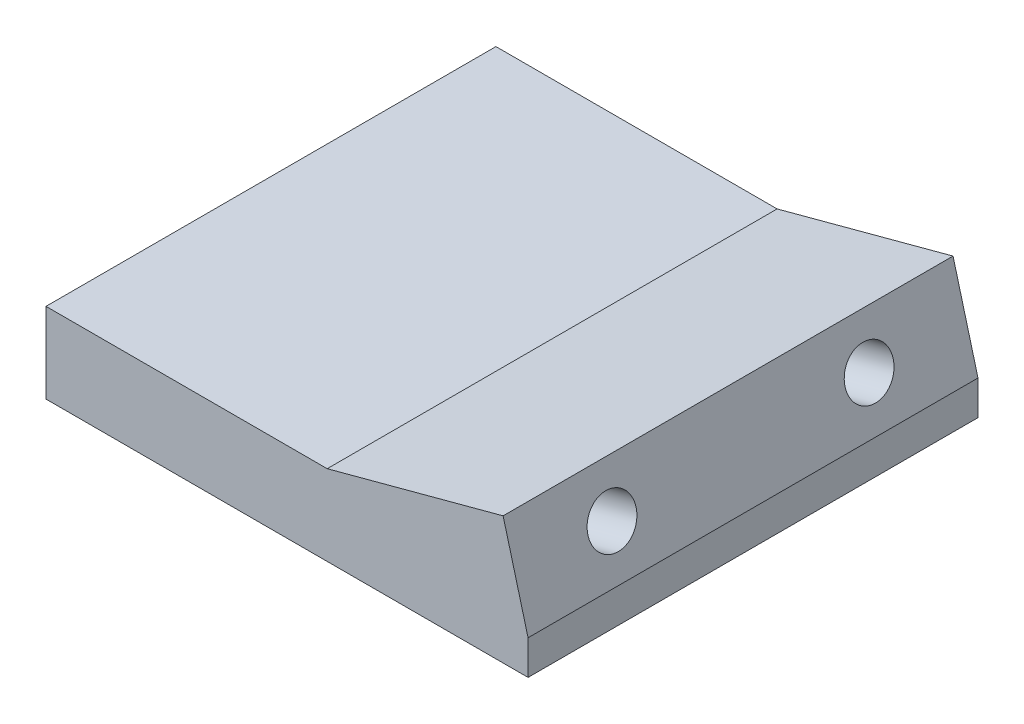
ISO-10303-21;
HEADER;
FILE_DESCRIPTION(('STEP AP214'),'2;1');
FILE_NAME('part.step','',(''),(''),'','','');
FILE_SCHEMA(('AUTOMOTIVE_DESIGN { 1 0 10303 214 1 1 1 1 }'));
ENDSEC;
DATA;
#1=APPLICATION_CONTEXT('core data for automotive mechanical design processes');
#2=APPLICATION_PROTOCOL_DEFINITION('international standard','automotive_design',2000,#1);
#3=PRODUCT_CONTEXT('',#1,'mechanical');
#4=PRODUCT('Part','Part','',(#3));
#5=PRODUCT_RELATED_PRODUCT_CATEGORY('part','',(#4));
#6=PRODUCT_DEFINITION_FORMATION('','',#4);
#7=PRODUCT_DEFINITION_CONTEXT('part definition',#1,'design');
#8=PRODUCT_DEFINITION('design','',#6,#7);
#9=PRODUCT_DEFINITION_SHAPE('','',#8);
#10=(LENGTH_UNIT() NAMED_UNIT(*) SI_UNIT(.MILLI.,.METRE.));
#11=(NAMED_UNIT(*) PLANE_ANGLE_UNIT() SI_UNIT($,.RADIAN.));
#12=(NAMED_UNIT(*) SI_UNIT($,.STERADIAN.) SOLID_ANGLE_UNIT());
#13=UNCERTAINTY_MEASURE_WITH_UNIT(LENGTH_MEASURE(1.E-05),#10,'distance_accuracy_value','');
#14=(GEOMETRIC_REPRESENTATION_CONTEXT(3) GLOBAL_UNCERTAINTY_ASSIGNED_CONTEXT((#13)) GLOBAL_UNIT_ASSIGNED_CONTEXT((#10,
#11,#12)) REPRESENTATION_CONTEXT('',''));
#15=CARTESIAN_POINT('',(0.,0.,0.));
#16=DIRECTION('',(0.,0.,1.));
#17=DIRECTION('',(1.,0.,0.));
#18=AXIS2_PLACEMENT_3D('',#15,#16,#17);
#19=CARTESIAN_POINT('',(0.,0.,44.45));
#20=DIRECTION('',(1.,0.,0.));
#21=DIRECTION('',(0.,0.,-1.));
#22=AXIS2_PLACEMENT_3D('',#19,#20,#21);
#23=PLANE('',#22);
#24=DIRECTION('',(0.,-1.,0.));
#25=VECTOR('',#24,1.);
#26=CARTESIAN_POINT('',(0.,0.,-44.45));
#27=LINE('',#26,#25);
#28=CARTESIAN_POINT('',(0.,15.875,-44.45));
#29=VERTEX_POINT('',#28);
#30=CARTESIAN_POINT('',(0.,0.,-44.45));
#31=VERTEX_POINT('',#30);
#32=EDGE_CURVE('E128',#29,#31,#27,.T.);
#33=ORIENTED_EDGE('',*,*,#32,.T.);
#34=DIRECTION('',(0.,0.,-1.));
#35=VECTOR('',#34,1.);
#36=CARTESIAN_POINT('',(0.,0.,44.45));
#37=LINE('',#36,#35);
#38=CARTESIAN_POINT('',(0.,0.,44.45));
#39=VERTEX_POINT('',#38);
#40=EDGE_CURVE('E11',#39,#31,#37,.T.);
#41=ORIENTED_EDGE('',*,*,#40,.F.);
#42=DIRECTION('',(0.,-1.,0.));
#43=VECTOR('',#42,1.);
#44=CARTESIAN_POINT('',(0.,0.,44.45));
#45=LINE('',#44,#43);
#46=CARTESIAN_POINT('',(0.,15.875,44.45));
#47=VERTEX_POINT('',#46);
#48=EDGE_CURVE('E145',#47,#39,#45,.T.);
#49=ORIENTED_EDGE('',*,*,#48,.F.);
#50=DIRECTION('',(0.,0.,-1.));
#51=VECTOR('',#50,1.);
#52=CARTESIAN_POINT('',(0.,15.875,44.45));
#53=LINE('',#52,#51);
#54=EDGE_CURVE('E124',#47,#29,#53,.T.);
#55=ORIENTED_EDGE('',*,*,#54,.T.);
#56=EDGE_LOOP('',(#33,#41,#49,#55));
#57=FACE_BOUND('',#56,.T.);
#58=ADVANCED_FACE('F39',(#57),#23,.F.);
#59=CARTESIAN_POINT('',(0.,0.,44.45));
#60=DIRECTION('',(0.,1.,0.));
#61=DIRECTION('',(0.,0.,1.));
#62=AXIS2_PLACEMENT_3D('',#59,#60,#61);
#63=PLANE('',#62);
#64=CARTESIAN_POINT('',(33.1179674114575,0.,25.4));
#65=DIRECTION('',(0.,1.,0.));
#66=DIRECTION('',(1.,0.,0.));
#67=AXIS2_PLACEMENT_3D('',#64,#65,#66);
#68=ELLIPSE('',#67,18.4008869908067,4.76249999999999);
#69=CARTESIAN_POINT('',(51.5188544022642,0.,25.4));
#70=VERTEX_POINT('',#69);
#71=EDGE_CURVE('E198',#70,#70,#68,.T.);
#72=ORIENTED_EDGE('',*,*,#71,.T.);
#73=EDGE_LOOP('',(#72));
#74=FACE_BOUND('',#73,.T.);
#75=CARTESIAN_POINT('',(33.1179674114575,0.,-25.4));
#76=DIRECTION('',(0.,1.,0.));
#77=DIRECTION('',(1.,0.,0.));
#78=AXIS2_PLACEMENT_3D('',#75,#76,#77);
#79=ELLIPSE('',#78,18.4008869908067,4.76249999999999);
#80=CARTESIAN_POINT('',(51.5188544022642,0.,-25.4));
#81=VERTEX_POINT('',#80);
#82=EDGE_CURVE('E133',#81,#81,#79,.T.);
#83=ORIENTED_EDGE('',*,*,#82,.T.);
#84=EDGE_LOOP('',(#83));
#85=FACE_BOUND('',#84,.T.);
#86=DIRECTION('',(1.,0.,0.));
#87=VECTOR('',#86,1.);
#88=CARTESIAN_POINT('',(0.,0.,-44.45));
#89=LINE('',#88,#87);
#90=CARTESIAN_POINT('',(95.25,0.,-44.45));
#91=VERTEX_POINT('',#90);
#92=EDGE_CURVE('E132',#31,#91,#89,.T.);
#93=ORIENTED_EDGE('',*,*,#92,.T.);
#94=DIRECTION('',(0.,0.,-1.));
#95=VECTOR('',#94,1.);
#96=CARTESIAN_POINT('',(95.25,0.,44.45));
#97=LINE('',#96,#95);
#98=CARTESIAN_POINT('',(95.25,0.,44.45));
#99=VERTEX_POINT('',#98);
#100=EDGE_CURVE('E48',#99,#91,#97,.T.);
#101=ORIENTED_EDGE('',*,*,#100,.F.);
#102=DIRECTION('',(1.,0.,0.));
#103=VECTOR('',#102,1.);
#104=CARTESIAN_POINT('',(0.,0.,44.45));
#105=LINE('',#104,#103);
#106=EDGE_CURVE('E93',#39,#99,#105,.T.);
#107=ORIENTED_EDGE('',*,*,#106,.F.);
#108=ORIENTED_EDGE('',*,*,#40,.T.);
#109=EDGE_LOOP('',(#93,#101,#107,#108));
#110=FACE_BOUND('',#109,.T.);
#111=ADVANCED_FACE('F173',(#74,#85,#110),#63,.F.);
#112=CARTESIAN_POINT('',(95.25,0.,44.45));
#113=DIRECTION('',(-1.,0.,0.));
#114=DIRECTION('',(0.,-1.,0.));
#115=AXIS2_PLACEMENT_3D('',#112,#113,#114);
#116=PLANE('',#115);
#117=DIRECTION('',(0.,1.,0.));
#118=VECTOR('',#117,1.);
#119=CARTESIAN_POINT('',(95.25,0.,-44.45));
#120=LINE('',#119,#118);
#121=CARTESIAN_POINT('',(95.25,6.78722233779814,-44.45));
#122=VERTEX_POINT('',#121);
#123=EDGE_CURVE('E136',#91,#122,#120,.T.);
#124=ORIENTED_EDGE('',*,*,#123,.T.);
#125=DIRECTION('',(0.,0.,-1.));
#126=VECTOR('',#125,1.);
#127=CARTESIAN_POINT('',(95.25,6.78722233779814,44.45));
#128=LINE('',#127,#126);
#129=CARTESIAN_POINT('',(95.25,6.78722233779814,44.45));
#130=VERTEX_POINT('',#129);
#131=EDGE_CURVE('E117',#130,#122,#128,.T.);
#132=ORIENTED_EDGE('',*,*,#131,.F.);
#133=DIRECTION('',(0.,1.,0.));
#134=VECTOR('',#133,1.);
#135=CARTESIAN_POINT('',(95.25,0.,44.45));
#136=LINE('',#135,#134);
#137=EDGE_CURVE('E106',#99,#130,#136,.T.);
#138=ORIENTED_EDGE('',*,*,#137,.F.);
#139=ORIENTED_EDGE('',*,*,#100,.T.);
#140=EDGE_LOOP('',(#124,#132,#138,#139));
#141=FACE_BOUND('',#140,.T.);
#142=ADVANCED_FACE('F155',(#141),#116,.F.);
#143=CARTESIAN_POINT('',(95.25,6.78722233779814,44.45));
#144=DIRECTION('',(-0.965925826289068,-0.258819045102522,0.));
#145=DIRECTION('',(0.258819045102522,-0.965925826289068,0.));
#146=AXIS2_PLACEMENT_3D('',#143,#144,#145);
#147=PLANE('',#146);
#148=CARTESIAN_POINT('',(92.7847485953985,15.9876658332015,25.4));
#149=DIRECTION('',(0.965925826289068,0.258819045102521,0.));
#150=DIRECTION('',(-0.258819045102521,0.965925826289068,0.));
#151=AXIS2_PLACEMENT_3D('',#148,#149,#150);
#152=CIRCLE('',#151,4.7625);
#153=CARTESIAN_POINT('',(91.5521228930977,20.5878875809032,25.4));
#154=VERTEX_POINT('',#153);
#155=EDGE_CURVE('E192',#154,#154,#152,.T.);
#156=ORIENTED_EDGE('',*,*,#155,.F.);
#157=EDGE_LOOP('',(#156));
#158=FACE_BOUND('',#157,.T.);
#159=CARTESIAN_POINT('',(92.7847485953985,15.9876658332015,-25.4));
#160=DIRECTION('',(0.965925826289068,0.258819045102521,0.));
#161=DIRECTION('',(-0.258819045102521,0.965925826289068,0.));
#162=AXIS2_PLACEMENT_3D('',#159,#160,#161);
#163=CIRCLE('',#162,4.7625);
#164=CARTESIAN_POINT('',(91.5521228930977,20.5878875809032,-25.4));
#165=VERTEX_POINT('',#164);
#166=EDGE_CURVE('E195',#165,#165,#163,.T.);
#167=ORIENTED_EDGE('',*,*,#166,.F.);
#168=EDGE_LOOP('',(#167));
#169=FACE_BOUND('',#168,.T.);
#170=DIRECTION('',(-0.258819045102522,0.965925826289068,0.));
#171=VECTOR('',#170,1.);
#172=CARTESIAN_POINT('',(95.25,6.78722233779814,-44.45));
#173=LINE('',#172,#171);
#174=CARTESIAN_POINT('',(90.319497190797,25.1881093286049,-44.45));
#175=VERTEX_POINT('',#174);
#176=EDGE_CURVE('E115',#122,#175,#173,.T.);
#177=ORIENTED_EDGE('',*,*,#176,.T.);
#178=DIRECTION('',(0.,0.,-1.));
#179=VECTOR('',#178,1.);
#180=CARTESIAN_POINT('',(90.319497190797,25.1881093286049,44.45));
#181=LINE('',#180,#179);
#182=CARTESIAN_POINT('',(90.319497190797,25.1881093286049,44.45));
#183=VERTEX_POINT('',#182);
#184=EDGE_CURVE('E112',#183,#175,#181,.T.);
#185=ORIENTED_EDGE('',*,*,#184,.F.);
#186=DIRECTION('',(-0.258819045102522,0.965925826289068,0.));
#187=VECTOR('',#186,1.);
#188=CARTESIAN_POINT('',(95.25,6.78722233779814,44.45));
#189=LINE('',#188,#187);
#190=EDGE_CURVE('E100',#130,#183,#189,.T.);
#191=ORIENTED_EDGE('',*,*,#190,.F.);
#192=ORIENTED_EDGE('',*,*,#131,.T.);
#193=EDGE_LOOP('',(#177,#185,#191,#192));
#194=FACE_BOUND('',#193,.T.);
#195=ADVANCED_FACE('F113',(#158,#169,#194),#147,.F.);
#196=CARTESIAN_POINT('',(55.5625,15.875,44.45));
#197=DIRECTION('',(0.258819045102522,-0.965925826289068,0.));
#198=DIRECTION('',(0.965925826289068,0.258819045102522,0.));
#199=AXIS2_PLACEMENT_3D('',#196,#197,#198);
#200=PLANE('',#199);
#201=DIRECTION('',(-0.965925826289068,-0.258819045102522,0.));
#202=VECTOR('',#201,1.);
#203=CARTESIAN_POINT('',(55.5625,15.875,-44.45));
#204=LINE('',#203,#202);
#205=CARTESIAN_POINT('',(55.5625,15.875,-44.45));
#206=VERTEX_POINT('',#205);
#207=EDGE_CURVE('E79',#175,#206,#204,.T.);
#208=ORIENTED_EDGE('',*,*,#207,.T.);
#209=DIRECTION('',(0.,0.,-1.));
#210=VECTOR('',#209,1.);
#211=CARTESIAN_POINT('',(55.5625,15.875,44.45));
#212=LINE('',#211,#210);
#213=CARTESIAN_POINT('',(55.5625,15.875,44.45));
#214=VERTEX_POINT('',#213);
#215=EDGE_CURVE('E118',#214,#206,#212,.T.);
#216=ORIENTED_EDGE('',*,*,#215,.F.);
#217=DIRECTION('',(-0.965925826289068,-0.258819045102522,0.));
#218=VECTOR('',#217,1.);
#219=CARTESIAN_POINT('',(55.5625,15.875,44.45));
#220=LINE('',#219,#218);
#221=EDGE_CURVE('E104',#183,#214,#220,.T.);
#222=ORIENTED_EDGE('',*,*,#221,.F.);
#223=ORIENTED_EDGE('',*,*,#184,.T.);
#224=EDGE_LOOP('',(#208,#216,#222,#223));
#225=FACE_BOUND('',#224,.T.);
#226=ADVANCED_FACE('F120',(#225),#200,.F.);
#227=CARTESIAN_POINT('',(0.,15.875,44.45));
#228=DIRECTION('',(0.,-1.,0.));
#229=DIRECTION('',(0.,0.,-1.));
#230=AXIS2_PLACEMENT_3D('',#227,#228,#229);
#231=PLANE('',#230);
#232=DIRECTION('',(-1.,0.,0.));
#233=VECTOR('',#232,1.);
#234=CARTESIAN_POINT('',(0.,15.875,-44.45));
#235=LINE('',#234,#233);
#236=EDGE_CURVE('E85',#206,#29,#235,.T.);
#237=ORIENTED_EDGE('',*,*,#236,.T.);
#238=ORIENTED_EDGE('',*,*,#54,.F.);
#239=DIRECTION('',(-1.,0.,0.));
#240=VECTOR('',#239,1.);
#241=CARTESIAN_POINT('',(0.,15.875,44.45));
#242=LINE('',#241,#240);
#243=EDGE_CURVE('E56',#214,#47,#242,.T.);
#244=ORIENTED_EDGE('',*,*,#243,.F.);
#245=ORIENTED_EDGE('',*,*,#215,.T.);
#246=EDGE_LOOP('',(#237,#238,#244,#245));
#247=FACE_BOUND('',#246,.T.);
#248=ADVANCED_FACE('F162',(#247),#231,.F.);
#249=CARTESIAN_POINT('',(0.,0.,44.45));
#250=DIRECTION('',(0.,0.,-1.));
#251=DIRECTION('',(-1.,0.,0.));
#252=AXIS2_PLACEMENT_3D('',#249,#250,#251);
#253=PLANE('',#252);
#254=ORIENTED_EDGE('',*,*,#48,.T.);
#255=ORIENTED_EDGE('',*,*,#106,.T.);
#256=ORIENTED_EDGE('',*,*,#137,.T.);
#257=ORIENTED_EDGE('',*,*,#190,.T.);
#258=ORIENTED_EDGE('',*,*,#221,.T.);
#259=ORIENTED_EDGE('',*,*,#243,.T.);
#260=EDGE_LOOP('',(#254,#255,#256,#257,#258,#259));
#261=FACE_BOUND('',#260,.T.);
#262=ADVANCED_FACE('F102',(#261),#253,.F.);
#263=CARTESIAN_POINT('',(0.,0.,-44.45));
#264=DIRECTION('',(0.,0.,-1.));
#265=DIRECTION('',(-1.,0.,0.));
#266=AXIS2_PLACEMENT_3D('',#263,#264,#265);
#267=PLANE('',#266);
#268=ORIENTED_EDGE('',*,*,#32,.F.);
#269=ORIENTED_EDGE('',*,*,#236,.F.);
#270=ORIENTED_EDGE('',*,*,#207,.F.);
#271=ORIENTED_EDGE('',*,*,#176,.F.);
#272=ORIENTED_EDGE('',*,*,#123,.F.);
#273=ORIENTED_EDGE('',*,*,#92,.F.);
#274=EDGE_LOOP('',(#268,#269,#270,#271,#272,#273));
#275=FACE_BOUND('',#274,.T.);
#276=ADVANCED_FACE('F158',(#275),#267,.T.);
#277=CARTESIAN_POINT('',(92.7847485953985,15.9876658332015,-25.4));
#278=DIRECTION('',(0.965925826289068,0.258819045102521,0.));
#279=DIRECTION('',(-0.258819045102521,0.965925826289068,0.));
#280=AXIS2_PLACEMENT_3D('',#277,#278,#279);
#281=CYLINDRICAL_SURFACE('',#280,4.76249999999999);
#282=ORIENTED_EDGE('',*,*,#166,.T.);
#283=EDGE_LOOP('',(#282));
#284=FACE_BOUND('',#283,.T.);
#285=ORIENTED_EDGE('',*,*,#82,.F.);
#286=EDGE_LOOP('',(#285));
#287=FACE_BOUND('',#286,.T.);
#288=ADVANCED_FACE('F216',(#284,#287),#281,.F.);
#289=CARTESIAN_POINT('',(92.7847485953985,15.9876658332015,25.4));
#290=DIRECTION('',(0.965925826289068,0.258819045102521,0.));
#291=DIRECTION('',(-0.258819045102521,0.965925826289068,0.));
#292=AXIS2_PLACEMENT_3D('',#289,#290,#291);
#293=CYLINDRICAL_SURFACE('',#292,4.76249999999999);
#294=ORIENTED_EDGE('',*,*,#155,.T.);
#295=EDGE_LOOP('',(#294));
#296=FACE_BOUND('',#295,.T.);
#297=ORIENTED_EDGE('',*,*,#71,.F.);
#298=EDGE_LOOP('',(#297));
#299=FACE_BOUND('',#298,.T.);
#300=ADVANCED_FACE('F213',(#296,#299),#293,.F.);
#301=CLOSED_SHELL('',(#58,#111,#142,#195,#226,#248,#262,#276,#288,#300));
#302=MANIFOLD_SOLID_BREP('B2',#301);
#303=ADVANCED_BREP_SHAPE_REPRESENTATION('',(#18,#302),#14);
#304=SHAPE_DEFINITION_REPRESENTATION(#9,#303);
ENDSEC;
END-ISO-10303-21;
